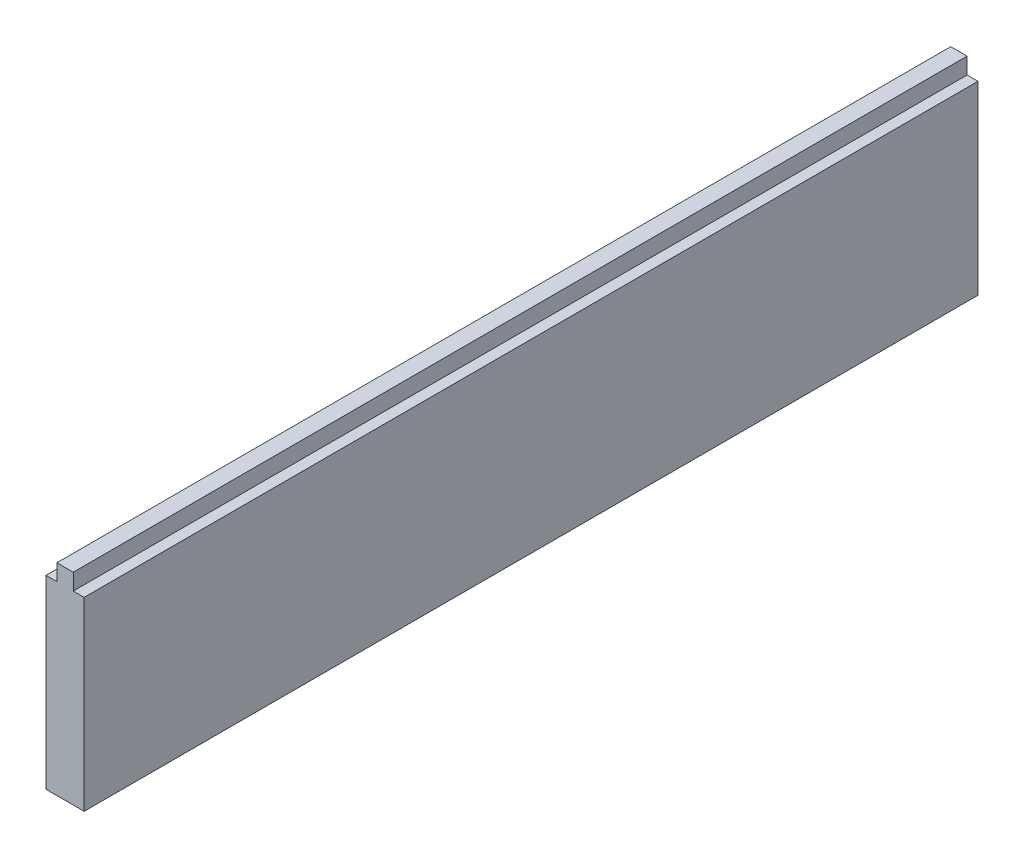
ISO-10303-21;
HEADER;
FILE_DESCRIPTION(('STEP AP214'),'2;1');
FILE_NAME('part.step','',(''),(''),'','','');
FILE_SCHEMA(('AUTOMOTIVE_DESIGN { 1 0 10303 214 1 1 1 1 }'));
ENDSEC;
DATA;
#1=APPLICATION_CONTEXT('core data for automotive mechanical design processes');
#2=APPLICATION_PROTOCOL_DEFINITION('international standard','automotive_design',2000,#1);
#3=PRODUCT_CONTEXT('',#1,'mechanical');
#4=PRODUCT('Part','Part','',(#3));
#5=PRODUCT_RELATED_PRODUCT_CATEGORY('part','',(#4));
#6=PRODUCT_DEFINITION_FORMATION('','',#4);
#7=PRODUCT_DEFINITION_CONTEXT('part definition',#1,'design');
#8=PRODUCT_DEFINITION('design','',#6,#7);
#9=PRODUCT_DEFINITION_SHAPE('','',#8);
#10=(LENGTH_UNIT() NAMED_UNIT(*) SI_UNIT(.MILLI.,.METRE.));
#11=(NAMED_UNIT(*) PLANE_ANGLE_UNIT() SI_UNIT($,.RADIAN.));
#12=(NAMED_UNIT(*) SI_UNIT($,.STERADIAN.) SOLID_ANGLE_UNIT());
#13=UNCERTAINTY_MEASURE_WITH_UNIT(LENGTH_MEASURE(1.E-05),#10,'distance_accuracy_value','');
#14=(GEOMETRIC_REPRESENTATION_CONTEXT(3) GLOBAL_UNCERTAINTY_ASSIGNED_CONTEXT((#13)) GLOBAL_UNIT_ASSIGNED_CONTEXT((#10,
#11,#12)) REPRESENTATION_CONTEXT('',''));
#15=CARTESIAN_POINT('',(0.,0.,0.));
#16=DIRECTION('',(0.,0.,1.));
#17=DIRECTION('',(1.,0.,0.));
#18=AXIS2_PLACEMENT_3D('',#15,#16,#17);
#19=CARTESIAN_POINT('',(0.,0.,-820.));
#20=DIRECTION('',(0.,-1.,0.));
#21=DIRECTION('',(0.,0.,-1.));
#22=AXIS2_PLACEMENT_3D('',#19,#20,#21);
#23=PLANE('',#22);
#24=DIRECTION('',(1.,0.,0.));
#25=VECTOR('',#24,1.);
#26=CARTESIAN_POINT('',(0.,0.,0.));
#27=LINE('',#26,#25);
#28=CARTESIAN_POINT('',(0.,0.,0.));
#29=VERTEX_POINT('',#28);
#30=CARTESIAN_POINT('',(35.,0.,0.));
#31=VERTEX_POINT('',#30);
#32=EDGE_CURVE('E132',#29,#31,#27,.T.);
#33=ORIENTED_EDGE('',*,*,#32,.F.);
#34=DIRECTION('',(0.,0.,1.));
#35=VECTOR('',#34,1.);
#36=CARTESIAN_POINT('',(0.,0.,-820.));
#37=LINE('',#36,#35);
#38=CARTESIAN_POINT('',(0.,0.,-820.));
#39=VERTEX_POINT('',#38);
#40=EDGE_CURVE('E11',#39,#29,#37,.T.);
#41=ORIENTED_EDGE('',*,*,#40,.F.);
#42=DIRECTION('',(1.,0.,0.));
#43=VECTOR('',#42,1.);
#44=CARTESIAN_POINT('',(0.,0.,-820.));
#45=LINE('',#44,#43);
#46=CARTESIAN_POINT('',(35.,0.,-820.));
#47=VERTEX_POINT('',#46);
#48=EDGE_CURVE('E152',#39,#47,#45,.T.);
#49=ORIENTED_EDGE('',*,*,#48,.T.);
#50=DIRECTION('',(0.,0.,1.));
#51=VECTOR('',#50,1.);
#52=CARTESIAN_POINT('',(35.,0.,-820.));
#53=LINE('',#52,#51);
#54=EDGE_CURVE('E38',#47,#31,#53,.T.);
#55=ORIENTED_EDGE('',*,*,#54,.T.);
#56=EDGE_LOOP('',(#33,#41,#49,#55));
#57=FACE_BOUND('',#56,.T.);
#58=ADVANCED_FACE('F35',(#57),#23,.T.);
#59=CARTESIAN_POINT('',(0.,0.,-820.));
#60=DIRECTION('',(-1.,0.,0.));
#61=DIRECTION('',(0.,0.,1.));
#62=AXIS2_PLACEMENT_3D('',#59,#60,#61);
#63=PLANE('',#62);
#64=DIRECTION('',(0.,-1.,0.));
#65=VECTOR('',#64,1.);
#66=CARTESIAN_POINT('',(0.,0.,0.));
#67=LINE('',#66,#65);
#68=CARTESIAN_POINT('',(0.,170.,0.));
#69=VERTEX_POINT('',#68);
#70=EDGE_CURVE('E150',#69,#29,#67,.T.);
#71=ORIENTED_EDGE('',*,*,#70,.F.);
#72=DIRECTION('',(0.,0.,1.));
#73=VECTOR('',#72,1.);
#74=CARTESIAN_POINT('',(0.,170.,-820.));
#75=LINE('',#74,#73);
#76=CARTESIAN_POINT('',(0.,170.,-820.));
#77=VERTEX_POINT('',#76);
#78=EDGE_CURVE('E44',#77,#69,#75,.T.);
#79=ORIENTED_EDGE('',*,*,#78,.F.);
#80=DIRECTION('',(0.,-1.,0.));
#81=VECTOR('',#80,1.);
#82=CARTESIAN_POINT('',(0.,0.,-820.));
#83=LINE('',#82,#81);
#84=EDGE_CURVE('E122',#77,#39,#83,.T.);
#85=ORIENTED_EDGE('',*,*,#84,.T.);
#86=ORIENTED_EDGE('',*,*,#40,.T.);
#87=EDGE_LOOP('',(#71,#79,#85,#86));
#88=FACE_BOUND('',#87,.T.);
#89=ADVANCED_FACE('F164',(#88),#63,.T.);
#90=CARTESIAN_POINT('',(10.,170.,-820.));
#91=DIRECTION('',(0.,1.,0.));
#92=DIRECTION('',(0.,0.,1.));
#93=AXIS2_PLACEMENT_3D('',#90,#91,#92);
#94=PLANE('',#93);
#95=DIRECTION('',(-1.,0.,0.));
#96=VECTOR('',#95,1.);
#97=CARTESIAN_POINT('',(10.,170.,0.));
#98=LINE('',#97,#96);
#99=CARTESIAN_POINT('',(10.,170.,0.));
#100=VERTEX_POINT('',#99);
#101=EDGE_CURVE('E109',#100,#69,#98,.T.);
#102=ORIENTED_EDGE('',*,*,#101,.F.);
#103=DIRECTION('',(0.,0.,1.));
#104=VECTOR('',#103,1.);
#105=CARTESIAN_POINT('',(10.,170.,-820.));
#106=LINE('',#105,#104);
#107=CARTESIAN_POINT('',(10.,170.,-820.));
#108=VERTEX_POINT('',#107);
#109=EDGE_CURVE('E104',#108,#100,#106,.T.);
#110=ORIENTED_EDGE('',*,*,#109,.F.);
#111=DIRECTION('',(-1.,0.,0.));
#112=VECTOR('',#111,1.);
#113=CARTESIAN_POINT('',(10.,170.,-820.));
#114=LINE('',#113,#112);
#115=EDGE_CURVE('E107',#108,#77,#114,.T.);
#116=ORIENTED_EDGE('',*,*,#115,.T.);
#117=ORIENTED_EDGE('',*,*,#78,.T.);
#118=EDGE_LOOP('',(#102,#110,#116,#117));
#119=FACE_BOUND('',#118,.T.);
#120=ADVANCED_FACE('F106',(#119),#94,.T.);
#121=CARTESIAN_POINT('',(10.,185.,-820.));
#122=DIRECTION('',(-1.,0.,0.));
#123=DIRECTION('',(0.,-1.,0.));
#124=AXIS2_PLACEMENT_3D('',#121,#122,#123);
#125=PLANE('',#124);
#126=DIRECTION('',(0.,-1.,0.));
#127=VECTOR('',#126,1.);
#128=CARTESIAN_POINT('',(10.,185.,0.));
#129=LINE('',#128,#127);
#130=CARTESIAN_POINT('',(10.,185.,0.));
#131=VERTEX_POINT('',#130);
#132=EDGE_CURVE('E147',#131,#100,#129,.T.);
#133=ORIENTED_EDGE('',*,*,#132,.F.);
#134=DIRECTION('',(0.,0.,1.));
#135=VECTOR('',#134,1.);
#136=CARTESIAN_POINT('',(10.,185.,-820.));
#137=LINE('',#136,#135);
#138=CARTESIAN_POINT('',(10.,185.,-820.));
#139=VERTEX_POINT('',#138);
#140=EDGE_CURVE('E114',#139,#131,#137,.T.);
#141=ORIENTED_EDGE('',*,*,#140,.F.);
#142=DIRECTION('',(0.,-1.,0.));
#143=VECTOR('',#142,1.);
#144=CARTESIAN_POINT('',(10.,185.,-820.));
#145=LINE('',#144,#143);
#146=EDGE_CURVE('E120',#139,#108,#145,.T.);
#147=ORIENTED_EDGE('',*,*,#146,.T.);
#148=ORIENTED_EDGE('',*,*,#109,.T.);
#149=EDGE_LOOP('',(#133,#141,#147,#148));
#150=FACE_BOUND('',#149,.T.);
#151=ADVANCED_FACE('F124',(#150),#125,.T.);
#152=CARTESIAN_POINT('',(25.,185.,-820.));
#153=DIRECTION('',(0.,1.,0.));
#154=DIRECTION('',(0.,0.,1.));
#155=AXIS2_PLACEMENT_3D('',#152,#153,#154);
#156=PLANE('',#155);
#157=DIRECTION('',(-1.,0.,0.));
#158=VECTOR('',#157,1.);
#159=CARTESIAN_POINT('',(25.,185.,0.));
#160=LINE('',#159,#158);
#161=CARTESIAN_POINT('',(25.,185.,0.));
#162=VERTEX_POINT('',#161);
#163=EDGE_CURVE('E144',#162,#131,#160,.T.);
#164=ORIENTED_EDGE('',*,*,#163,.F.);
#165=DIRECTION('',(0.,0.,1.));
#166=VECTOR('',#165,1.);
#167=CARTESIAN_POINT('',(25.,185.,-820.));
#168=LINE('',#167,#166);
#169=CARTESIAN_POINT('',(25.,185.,-820.));
#170=VERTEX_POINT('',#169);
#171=EDGE_CURVE('E156',#170,#162,#168,.T.);
#172=ORIENTED_EDGE('',*,*,#171,.F.);
#173=DIRECTION('',(-1.,0.,0.));
#174=VECTOR('',#173,1.);
#175=CARTESIAN_POINT('',(25.,185.,-820.));
#176=LINE('',#175,#174);
#177=EDGE_CURVE('E125',#170,#139,#176,.T.);
#178=ORIENTED_EDGE('',*,*,#177,.T.);
#179=ORIENTED_EDGE('',*,*,#140,.T.);
#180=EDGE_LOOP('',(#164,#172,#178,#179));
#181=FACE_BOUND('',#180,.T.);
#182=ADVANCED_FACE('F177',(#181),#156,.T.);
#183=CARTESIAN_POINT('',(25.,170.,-820.));
#184=DIRECTION('',(1.,0.,0.));
#185=DIRECTION('',(0.,1.,0.));
#186=AXIS2_PLACEMENT_3D('',#183,#184,#185);
#187=PLANE('',#186);
#188=DIRECTION('',(0.,1.,0.));
#189=VECTOR('',#188,1.);
#190=CARTESIAN_POINT('',(25.,170.,0.));
#191=LINE('',#190,#189);
#192=CARTESIAN_POINT('',(25.,170.,0.));
#193=VERTEX_POINT('',#192);
#194=EDGE_CURVE('E141',#193,#162,#191,.T.);
#195=ORIENTED_EDGE('',*,*,#194,.F.);
#196=DIRECTION('',(0.,0.,1.));
#197=VECTOR('',#196,1.);
#198=CARTESIAN_POINT('',(25.,170.,-820.));
#199=LINE('',#198,#197);
#200=CARTESIAN_POINT('',(25.,170.,-820.));
#201=VERTEX_POINT('',#200);
#202=EDGE_CURVE('E158',#201,#193,#199,.T.);
#203=ORIENTED_EDGE('',*,*,#202,.F.);
#204=DIRECTION('',(0.,1.,0.));
#205=VECTOR('',#204,1.);
#206=CARTESIAN_POINT('',(25.,170.,-820.));
#207=LINE('',#206,#205);
#208=EDGE_CURVE('E127',#201,#170,#207,.T.);
#209=ORIENTED_EDGE('',*,*,#208,.T.);
#210=ORIENTED_EDGE('',*,*,#171,.T.);
#211=EDGE_LOOP('',(#195,#203,#209,#210));
#212=FACE_BOUND('',#211,.T.);
#213=ADVANCED_FACE('F180',(#212),#187,.T.);
#214=CARTESIAN_POINT('',(35.,170.,-820.));
#215=DIRECTION('',(0.,1.,0.));
#216=DIRECTION('',(0.,0.,1.));
#217=AXIS2_PLACEMENT_3D('',#214,#215,#216);
#218=PLANE('',#217);
#219=DIRECTION('',(-1.,0.,0.));
#220=VECTOR('',#219,1.);
#221=CARTESIAN_POINT('',(35.,170.,0.));
#222=LINE('',#221,#220);
#223=CARTESIAN_POINT('',(35.,170.,0.));
#224=VERTEX_POINT('',#223);
#225=EDGE_CURVE('E138',#224,#193,#222,.T.);
#226=ORIENTED_EDGE('',*,*,#225,.F.);
#227=DIRECTION('',(0.,0.,1.));
#228=VECTOR('',#227,1.);
#229=CARTESIAN_POINT('',(35.,170.,-820.));
#230=LINE('',#229,#228);
#231=CARTESIAN_POINT('',(35.,170.,-820.));
#232=VERTEX_POINT('',#231);
#233=EDGE_CURVE('E159',#232,#224,#230,.T.);
#234=ORIENTED_EDGE('',*,*,#233,.F.);
#235=DIRECTION('',(-1.,0.,0.));
#236=VECTOR('',#235,1.);
#237=CARTESIAN_POINT('',(35.,170.,-820.));
#238=LINE('',#237,#236);
#239=EDGE_CURVE('E255',#232,#201,#238,.T.);
#240=ORIENTED_EDGE('',*,*,#239,.T.);
#241=ORIENTED_EDGE('',*,*,#202,.T.);
#242=EDGE_LOOP('',(#226,#234,#240,#241));
#243=FACE_BOUND('',#242,.T.);
#244=ADVANCED_FACE('F184',(#243),#218,.T.);
#245=CARTESIAN_POINT('',(35.,170.,-820.));
#246=DIRECTION('',(1.,0.,0.));
#247=DIRECTION('',(0.,1.,0.));
#248=AXIS2_PLACEMENT_3D('',#245,#246,#247);
#249=PLANE('',#248);
#250=DIRECTION('',(0.,1.,0.));
#251=VECTOR('',#250,1.);
#252=CARTESIAN_POINT('',(35.,170.,0.));
#253=LINE('',#252,#251);
#254=EDGE_CURVE('E135',#31,#224,#253,.T.);
#255=ORIENTED_EDGE('',*,*,#254,.F.);
#256=ORIENTED_EDGE('',*,*,#54,.F.);
#257=DIRECTION('',(0.,1.,0.));
#258=VECTOR('',#257,1.);
#259=CARTESIAN_POINT('',(35.,170.,-820.));
#260=LINE('',#259,#258);
#261=EDGE_CURVE('E256',#47,#232,#260,.T.);
#262=ORIENTED_EDGE('',*,*,#261,.T.);
#263=ORIENTED_EDGE('',*,*,#233,.T.);
#264=EDGE_LOOP('',(#255,#256,#262,#263));
#265=FACE_BOUND('',#264,.T.);
#266=ADVANCED_FACE('F161',(#265),#249,.T.);
#267=CARTESIAN_POINT('',(0.,0.,-820.));
#268=DIRECTION('',(0.,0.,-1.));
#269=DIRECTION('',(-1.,0.,0.));
#270=AXIS2_PLACEMENT_3D('',#267,#268,#269);
#271=PLANE('',#270);
#272=ORIENTED_EDGE('',*,*,#48,.F.);
#273=ORIENTED_EDGE('',*,*,#84,.F.);
#274=ORIENTED_EDGE('',*,*,#115,.F.);
#275=ORIENTED_EDGE('',*,*,#146,.F.);
#276=ORIENTED_EDGE('',*,*,#177,.F.);
#277=ORIENTED_EDGE('',*,*,#208,.F.);
#278=ORIENTED_EDGE('',*,*,#239,.F.);
#279=ORIENTED_EDGE('',*,*,#261,.F.);
#280=EDGE_LOOP('',(#272,#273,#274,#275,#276,#277,#278,#279));
#281=FACE_BOUND('',#280,.T.);
#282=ADVANCED_FACE('F118',(#281),#271,.T.);
#283=CARTESIAN_POINT('',(0.,0.,0.));
#284=DIRECTION('',(0.,0.,-1.));
#285=DIRECTION('',(-1.,0.,0.));
#286=AXIS2_PLACEMENT_3D('',#283,#284,#285);
#287=PLANE('',#286);
#288=ORIENTED_EDGE('',*,*,#32,.T.);
#289=ORIENTED_EDGE('',*,*,#254,.T.);
#290=ORIENTED_EDGE('',*,*,#225,.T.);
#291=ORIENTED_EDGE('',*,*,#194,.T.);
#292=ORIENTED_EDGE('',*,*,#163,.T.);
#293=ORIENTED_EDGE('',*,*,#132,.T.);
#294=ORIENTED_EDGE('',*,*,#101,.T.);
#295=ORIENTED_EDGE('',*,*,#70,.T.);
#296=EDGE_LOOP('',(#288,#289,#290,#291,#292,#293,#294,#295));
#297=FACE_BOUND('',#296,.T.);
#298=ADVANCED_FACE('F163',(#297),#287,.F.);
#299=CLOSED_SHELL('',(#58,#89,#120,#151,#182,#213,#244,#266,#282,#298));
#300=MANIFOLD_SOLID_BREP('B2',#299);
#301=ADVANCED_BREP_SHAPE_REPRESENTATION('',(#18,#300),#14);
#302=SHAPE_DEFINITION_REPRESENTATION(#9,#301);
ENDSEC;
END-ISO-10303-21;
